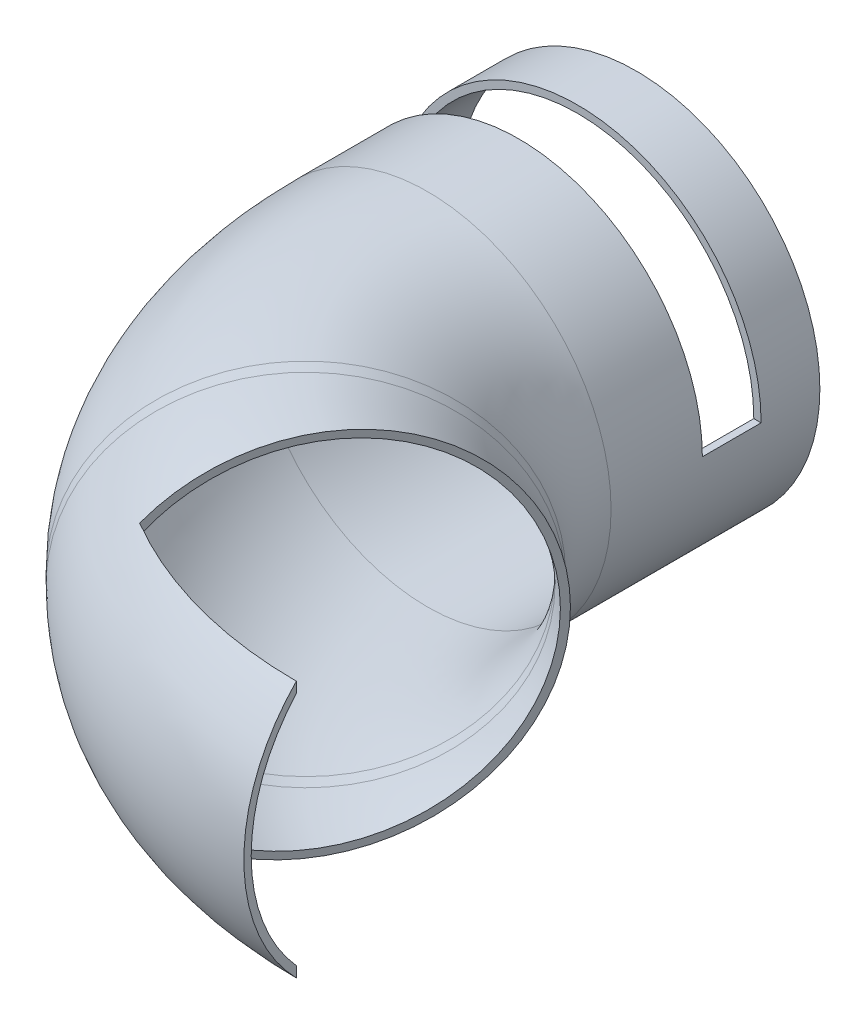
ISO-10303-21;
HEADER;
FILE_DESCRIPTION(('STEP AP214'),'2;1');
FILE_NAME('part.step','',(''),(''),'','','');
FILE_SCHEMA(('AUTOMOTIVE_DESIGN { 1 0 10303 214 1 1 1 1 }'));
ENDSEC;
DATA;
#1=APPLICATION_CONTEXT('core data for automotive mechanical design processes');
#2=APPLICATION_PROTOCOL_DEFINITION('international standard','automotive_design',2000,#1);
#3=PRODUCT_CONTEXT('',#1,'mechanical');
#4=PRODUCT('Part','Part','',(#3));
#5=PRODUCT_RELATED_PRODUCT_CATEGORY('part','',(#4));
#6=PRODUCT_DEFINITION_FORMATION('','',#4);
#7=PRODUCT_DEFINITION_CONTEXT('part definition',#1,'design');
#8=PRODUCT_DEFINITION('design','',#6,#7);
#9=PRODUCT_DEFINITION_SHAPE('','',#8);
#10=(LENGTH_UNIT() NAMED_UNIT(*) SI_UNIT(.MILLI.,.METRE.));
#11=(NAMED_UNIT(*) PLANE_ANGLE_UNIT() SI_UNIT($,.RADIAN.));
#12=(NAMED_UNIT(*) SI_UNIT($,.STERADIAN.) SOLID_ANGLE_UNIT());
#13=UNCERTAINTY_MEASURE_WITH_UNIT(LENGTH_MEASURE(1.E-05),#10,'distance_accuracy_value','');
#14=(GEOMETRIC_REPRESENTATION_CONTEXT(3) GLOBAL_UNCERTAINTY_ASSIGNED_CONTEXT((#13)) GLOBAL_UNIT_ASSIGNED_CONTEXT((#10,
#11,#12)) REPRESENTATION_CONTEXT('',''));
#15=CARTESIAN_POINT('',(0.,0.,0.));
#16=DIRECTION('',(0.,0.,1.));
#17=DIRECTION('',(1.,0.,0.));
#18=AXIS2_PLACEMENT_3D('',#15,#16,#17);
#19=CARTESIAN_POINT('',(0.,0.,0.));
#20=DIRECTION('',(0.,0.,1.));
#21=DIRECTION('',(1.,0.,0.));
#22=AXIS2_PLACEMENT_3D('',#19,#20,#21);
#23=CYLINDRICAL_SURFACE('',#22,25.);
#24=CARTESIAN_POINT('',(0.,0.,28.4314575050761));
#25=DIRECTION('',(0.,0.,1.));
#26=DIRECTION('',(1.,0.,0.));
#27=AXIS2_PLACEMENT_3D('',#24,#25,#26);
#28=CIRCLE('',#27,25.);
#29=CARTESIAN_POINT('',(-25.,0.,28.4314575050761));
#30=VERTEX_POINT('',#29);
#31=EDGE_CURVE('E157',#30,#30,#28,.T.);
#32=ORIENTED_EDGE('',*,*,#31,.F.);
#33=EDGE_LOOP('',(#32));
#34=FACE_BOUND('',#33,.T.);
#35=CARTESIAN_POINT('',(0.,0.,0.));
#36=DIRECTION('',(0.,0.,1.));
#37=DIRECTION('',(1.,0.,0.));
#38=AXIS2_PLACEMENT_3D('',#35,#36,#37);
#39=CIRCLE('',#38,25.);
#40=CARTESIAN_POINT('',(25.,0.,0.));
#41=VERTEX_POINT('',#40);
#42=EDGE_CURVE('E177',#41,#41,#39,.T.);
#43=ORIENTED_EDGE('',*,*,#42,.T.);
#44=EDGE_LOOP('',(#43));
#45=FACE_BOUND('',#44,.T.);
#46=DIRECTION('',(0.,0.,-1.));
#47=VECTOR('',#46,1.);
#48=CARTESIAN_POINT('',(25.,0.,16.));
#49=LINE('',#48,#47);
#50=CARTESIAN_POINT('',(25.,0.,16.));
#51=VERTEX_POINT('',#50);
#52=CARTESIAN_POINT('',(25.,0.,8.00000000000001));
#53=VERTEX_POINT('',#52);
#54=EDGE_CURVE('E118',#51,#53,#49,.T.);
#55=ORIENTED_EDGE('',*,*,#54,.F.);
#56=CARTESIAN_POINT('',(0.,0.,16.));
#57=DIRECTION('',(0.,0.,-1.));
#58=DIRECTION('',(-1.,0.,0.));
#59=AXIS2_PLACEMENT_3D('',#56,#57,#58);
#60=CIRCLE('',#59,25.);
#61=CARTESIAN_POINT('',(-25.,0.,16.));
#62=VERTEX_POINT('',#61);
#63=EDGE_CURVE('E114',#51,#62,#60,.F.);
#64=ORIENTED_EDGE('',*,*,#63,.T.);
#65=DIRECTION('',(0.,0.,1.));
#66=VECTOR('',#65,1.);
#67=CARTESIAN_POINT('',(-25.,0.,16.));
#68=LINE('',#67,#66);
#69=CARTESIAN_POINT('',(-25.,0.,8.00000000000001));
#70=VERTEX_POINT('',#69);
#71=EDGE_CURVE('E122',#70,#62,#68,.T.);
#72=ORIENTED_EDGE('',*,*,#71,.F.);
#73=CARTESIAN_POINT('',(0.,0.,8.00000000000001));
#74=DIRECTION('',(0.,0.,1.));
#75=DIRECTION('',(1.,0.,0.));
#76=AXIS2_PLACEMENT_3D('',#73,#74,#75);
#77=CIRCLE('',#76,25.);
#78=EDGE_CURVE('E129',#70,#53,#77,.F.);
#79=ORIENTED_EDGE('',*,*,#78,.T.);
#80=EDGE_LOOP('',(#55,#64,#72,#79));
#81=FACE_BOUND('',#80,.T.);
#82=ADVANCED_FACE('F44',(#34,#45,#81),#23,.T.);
#83=CARTESIAN_POINT('',(40.,0.,28.4314575050761));
#84=DIRECTION('',(0.,1.,0.));
#85=DIRECTION('',(0.,0.,1.));
#86=AXIS2_PLACEMENT_3D('',#83,#84,#85);
#87=TOROIDAL_SURFACE('',#86,40.,25.);
#88=CARTESIAN_POINT('',(11.7157287525381,0.,56.715728752538));
#89=DIRECTION('',(0.707106781186546,0.,0.707106781186549));
#90=DIRECTION('',(0.707106781186549,0.,-0.707106781186546));
#91=AXIS2_PLACEMENT_3D('',#88,#89,#90);
#92=CIRCLE('',#91,25.);
#93=CARTESIAN_POINT('',(-5.96194077712566,0.,74.3933982822016));
#94=VERTEX_POINT('',#93);
#95=EDGE_CURVE('E182',#94,#94,#92,.T.);
#96=CARTESIAN_POINT('',(40.,0.,28.4314575050761));
#97=DIRECTION('',(0.,1.,0.));
#98=DIRECTION('',(0.,0.,1.));
#99=AXIS2_PLACEMENT_3D('',#96,#97,#98);
#100=CIRCLE('',#99,65.);
#101=EDGE_CURVE('',#30,#94,#100,.T.);
#102=ORIENTED_EDGE('',*,*,#31,.T.);
#103=ORIENTED_EDGE('',*,*,#95,.F.);
#104=ORIENTED_EDGE('',*,*,#101,.T.);
#105=ORIENTED_EDGE('',*,*,#101,.F.);
#106=EDGE_LOOP('',(#102,#104,#103,#105));
#107=FACE_BOUND('',#106,.T.);
#108=ADVANCED_FACE('F213',(#107),#87,.T.);
#109=CARTESIAN_POINT('',(11.7157287525381,0.,56.715728752538));
#110=DIRECTION('',(0.707106781186543,0.,0.707106781186552));
#111=DIRECTION('',(0.707106781186552,0.,-0.707106781186543));
#112=AXIS2_PLACEMENT_3D('',#109,#110,#111);
#113=CYLINDRICAL_SURFACE('',#112,25.);
#114=CARTESIAN_POINT('',(13.033008588991,0.,58.0330085889909));
#115=DIRECTION('',(0.707106781186543,0.,0.707106781186552));
#116=DIRECTION('',(0.707106781186552,0.,-0.707106781186543));
#117=AXIS2_PLACEMENT_3D('',#114,#115,#116);
#118=CIRCLE('',#117,25.);
#119=CARTESIAN_POINT('',(30.7106781186548,0.,40.3553390593273));
#120=VERTEX_POINT('',#119);
#121=EDGE_CURVE('E179',#120,#120,#118,.T.);
#122=ORIENTED_EDGE('',*,*,#121,.F.);
#123=EDGE_LOOP('',(#122));
#124=FACE_BOUND('',#123,.T.);
#125=ORIENTED_EDGE('',*,*,#95,.T.);
#126=EDGE_LOOP('',(#125));
#127=FACE_BOUND('',#126,.T.);
#128=ADVANCED_FACE('F226',(#124,#127),#113,.T.);
#129=CARTESIAN_POINT('',(41.3172798364529,0.,29.748737341529));
#130=DIRECTION('',(0.,1.,0.));
#131=DIRECTION('',(0.,0.,1.));
#132=AXIS2_PLACEMENT_3D('',#129,#130,#131);
#133=TOROIDAL_SURFACE('',#132,39.9999999999999,25.);
#134=CARTESIAN_POINT('',(41.3172798364529,17.5,29.748737341529));
#135=DIRECTION('',(0.,1.,0.));
#136=DIRECTION('',(-0.506589296021684,0.,0.862187500000003));
#137=AXIS2_PLACEMENT_3D('',#134,#135,#136);
#138=CIRCLE('',#137,57.8535710713573);
#139=CARTESIAN_POINT('',(12.0092799950735,17.5,79.6293631496151));
#140=VERTEX_POINT('',#139);
#141=CARTESIAN_POINT('',(41.3172798364533,17.5,87.6023084128864));
#142=VERTEX_POINT('',#141);
#143=EDGE_CURVE('E138',#140,#142,#138,.T.);
#144=ORIENTED_EDGE('',*,*,#143,.F.);
#145=CARTESIAN_POINT('',(21.0537079955856,0.,64.2362373415291));
#146=DIRECTION('',(0.862187500000001,0.,0.506589296021686));
#147=DIRECTION('',(0.506589296021686,0.,-0.862187500000001));
#148=AXIS2_PLACEMENT_3D('',#145,#146,#147);
#149=CIRCLE('',#148,25.0000000000002);
#150=CARTESIAN_POINT('',(12.0092799950735,-17.5,79.6293631496151));
#151=VERTEX_POINT('',#150);
#152=EDGE_CURVE('E128',#151,#140,#149,.T.);
#153=ORIENTED_EDGE('',*,*,#152,.F.);
#154=CARTESIAN_POINT('',(41.3172798364529,-17.5,29.748737341529));
#155=DIRECTION('',(0.,1.,0.));
#156=DIRECTION('',(-0.506589296021684,0.,0.862187500000003));
#157=AXIS2_PLACEMENT_3D('',#154,#155,#156);
#158=CIRCLE('',#157,57.8535710713573);
#159=CARTESIAN_POINT('',(41.3172798364533,-17.5,87.6023084128864));
#160=VERTEX_POINT('',#159);
#161=EDGE_CURVE('E141',#151,#160,#158,.T.);
#162=ORIENTED_EDGE('',*,*,#161,.T.);
#163=CARTESIAN_POINT('',(41.3172798364529,0.,69.748737341529));
#164=DIRECTION('',(1.,0.,0.));
#165=DIRECTION('',(0.,0.,-1.));
#166=AXIS2_PLACEMENT_3D('',#163,#164,#165);
#167=CIRCLE('',#166,25.);
#168=EDGE_CURVE('E162',#142,#160,#167,.T.);
#169=ORIENTED_EDGE('',*,*,#168,.F.);
#170=EDGE_LOOP('',(#144,#153,#162,#169));
#171=FACE_BOUND('',#170,.T.);
#172=ORIENTED_EDGE('',*,*,#121,.T.);
#173=EDGE_LOOP('',(#172));
#174=FACE_BOUND('',#173,.T.);
#175=ADVANCED_FACE('F46',(#171,#174),#133,.T.);
#176=CARTESIAN_POINT('',(0.,0.,0.));
#177=DIRECTION('',(0.,0.,1.));
#178=DIRECTION('',(1.,0.,0.));
#179=AXIS2_PLACEMENT_3D('',#176,#177,#178);
#180=PLANE('',#179);
#181=CARTESIAN_POINT('',(0.,0.,0.));
#182=DIRECTION('',(0.,0.,1.));
#183=DIRECTION('',(1.,0.,0.));
#184=AXIS2_PLACEMENT_3D('',#181,#182,#183);
#185=CIRCLE('',#184,24.);
#186=CARTESIAN_POINT('',(24.,0.,0.));
#187=VERTEX_POINT('',#186);
#188=EDGE_CURVE('E158',#187,#187,#185,.F.);
#189=ORIENTED_EDGE('',*,*,#188,.F.);
#190=EDGE_LOOP('',(#189));
#191=FACE_BOUND('',#190,.T.);
#192=ORIENTED_EDGE('',*,*,#42,.F.);
#193=EDGE_LOOP('',(#192));
#194=FACE_BOUND('',#193,.T.);
#195=ADVANCED_FACE('F247',(#191,#194),#180,.F.);
#196=CARTESIAN_POINT('',(41.3172798364529,0.,69.748737341529));
#197=DIRECTION('',(1.,0.,0.));
#198=DIRECTION('',(0.,0.,-1.));
#199=AXIS2_PLACEMENT_3D('',#196,#197,#198);
#200=PLANE('',#199);
#201=DIRECTION('',(0.,-1.,-1.80479577913684E-13));
#202=VECTOR('',#201,1.);
#203=CARTESIAN_POINT('',(41.3172798364533,17.5,87.6023084128863));
#204=LINE('',#203,#202);
#205=CARTESIAN_POINT('',(41.3172798364533,16.0390149323455,87.6023084128861));
#206=VERTEX_POINT('',#205);
#207=EDGE_CURVE('E140',#142,#206,#204,.T.);
#208=ORIENTED_EDGE('',*,*,#207,.F.);
#209=ORIENTED_EDGE('',*,*,#168,.T.);
#210=DIRECTION('',(0.,-1.,0.));
#211=VECTOR('',#210,1.);
#212=CARTESIAN_POINT('',(41.3172798364533,-16.0390149323453,87.6023084128862));
#213=LINE('',#212,#211);
#214=CARTESIAN_POINT('',(41.3172798364533,-16.0390149323453,87.6023084128862));
#215=VERTEX_POINT('',#214);
#216=EDGE_CURVE('E154',#215,#160,#213,.T.);
#217=ORIENTED_EDGE('',*,*,#216,.F.);
#218=CARTESIAN_POINT('',(41.3172798364529,0.,69.748737341529));
#219=DIRECTION('',(1.,0.,0.));
#220=DIRECTION('',(0.,0.,-1.));
#221=AXIS2_PLACEMENT_3D('',#218,#219,#220);
#222=CIRCLE('',#221,24.);
#223=EDGE_CURVE('E171',#215,#206,#222,.F.);
#224=ORIENTED_EDGE('',*,*,#223,.T.);
#225=EDGE_LOOP('',(#208,#209,#217,#224));
#226=FACE_BOUND('',#225,.T.);
#227=ADVANCED_FACE('F245',(#226),#200,.T.);
#228=CARTESIAN_POINT('',(0.,0.,0.));
#229=DIRECTION('',(0.,0.,1.));
#230=DIRECTION('',(1.,0.,0.));
#231=AXIS2_PLACEMENT_3D('',#228,#229,#230);
#232=CYLINDRICAL_SURFACE('',#231,24.);
#233=DIRECTION('',(0.,0.,1.));
#234=VECTOR('',#233,1.);
#235=CARTESIAN_POINT('',(24.,0.,0.));
#236=LINE('',#235,#234);
#237=CARTESIAN_POINT('',(24.,0.,8.00000000000001));
#238=VERTEX_POINT('',#237);
#239=CARTESIAN_POINT('',(24.,0.,16.));
#240=VERTEX_POINT('',#239);
#241=EDGE_CURVE('E13',#238,#240,#236,.T.);
#242=ORIENTED_EDGE('',*,*,#241,.F.);
#243=CARTESIAN_POINT('',(0.,0.,8.00000000000001));
#244=DIRECTION('',(0.,0.,1.));
#245=DIRECTION('',(1.,0.,0.));
#246=AXIS2_PLACEMENT_3D('',#243,#244,#245);
#247=CIRCLE('',#246,24.);
#248=CARTESIAN_POINT('',(-24.,0.,8.00000000000001));
#249=VERTEX_POINT('',#248);
#250=EDGE_CURVE('E188',#238,#249,#247,.T.);
#251=ORIENTED_EDGE('',*,*,#250,.T.);
#252=DIRECTION('',(0.,0.,1.));
#253=VECTOR('',#252,1.);
#254=CARTESIAN_POINT('',(-24.,0.,0.));
#255=LINE('',#254,#253);
#256=CARTESIAN_POINT('',(-24.,0.,16.));
#257=VERTEX_POINT('',#256);
#258=EDGE_CURVE('E174',#257,#249,#255,.F.);
#259=ORIENTED_EDGE('',*,*,#258,.F.);
#260=CARTESIAN_POINT('',(0.,0.,16.));
#261=DIRECTION('',(0.,0.,-1.));
#262=DIRECTION('',(-1.,0.,0.));
#263=AXIS2_PLACEMENT_3D('',#260,#261,#262);
#264=CIRCLE('',#263,24.);
#265=EDGE_CURVE('E52',#257,#240,#264,.T.);
#266=ORIENTED_EDGE('',*,*,#265,.T.);
#267=EDGE_LOOP('',(#242,#251,#259,#266));
#268=FACE_BOUND('',#267,.T.);
#269=CARTESIAN_POINT('',(0.,0.,28.4314575050761));
#270=DIRECTION('',(0.,0.,1.));
#271=DIRECTION('',(1.,0.,0.));
#272=AXIS2_PLACEMENT_3D('',#269,#270,#271);
#273=CIRCLE('',#272,24.);
#274=CARTESIAN_POINT('',(-24.,0.,28.4314575050761));
#275=VERTEX_POINT('',#274);
#276=EDGE_CURVE('E161',#275,#275,#273,.F.);
#277=ORIENTED_EDGE('',*,*,#276,.F.);
#278=EDGE_LOOP('',(#277));
#279=FACE_BOUND('',#278,.T.);
#280=ORIENTED_EDGE('',*,*,#188,.T.);
#281=EDGE_LOOP('',(#280));
#282=FACE_BOUND('',#281,.T.);
#283=ADVANCED_FACE('F192',(#268,#279,#282),#232,.F.);
#284=CARTESIAN_POINT('',(40.,0.,28.4314575050761));
#285=DIRECTION('',(0.,1.,0.));
#286=DIRECTION('',(0.,0.,1.));
#287=AXIS2_PLACEMENT_3D('',#284,#285,#286);
#288=TOROIDAL_SURFACE('',#287,40.,24.);
#289=CARTESIAN_POINT('',(11.7157287525381,0.,56.715728752538));
#290=DIRECTION('',(0.707106781186546,0.,0.707106781186549));
#291=DIRECTION('',(0.707106781186549,0.,-0.707106781186546));
#292=AXIS2_PLACEMENT_3D('',#289,#290,#291);
#293=CIRCLE('',#292,24.);
#294=CARTESIAN_POINT('',(-5.25483399593912,0.,73.6862915010151));
#295=VERTEX_POINT('',#294);
#296=EDGE_CURVE('E165',#295,#295,#293,.F.);
#297=CARTESIAN_POINT('',(40.,0.,28.4314575050761));
#298=DIRECTION('',(0.,1.,0.));
#299=DIRECTION('',(0.,0.,1.));
#300=AXIS2_PLACEMENT_3D('',#297,#298,#299);
#301=CIRCLE('',#300,64.);
#302=EDGE_CURVE('',#275,#295,#301,.T.);
#303=ORIENTED_EDGE('',*,*,#276,.T.);
#304=ORIENTED_EDGE('',*,*,#296,.F.);
#305=ORIENTED_EDGE('',*,*,#302,.T.);
#306=ORIENTED_EDGE('',*,*,#302,.F.);
#307=EDGE_LOOP('',(#303,#305,#304,#306));
#308=FACE_BOUND('',#307,.T.);
#309=ADVANCED_FACE('F239',(#308),#288,.F.);
#310=CARTESIAN_POINT('',(11.7157287525381,0.,56.715728752538));
#311=DIRECTION('',(0.707106781186543,0.,0.707106781186552));
#312=DIRECTION('',(0.707106781186552,0.,-0.707106781186543));
#313=AXIS2_PLACEMENT_3D('',#310,#311,#312);
#314=CYLINDRICAL_SURFACE('',#313,24.);
#315=CARTESIAN_POINT('',(13.033008588991,0.,58.0330085889909));
#316=DIRECTION('',(0.707106781186543,0.,0.707106781186552));
#317=DIRECTION('',(0.707106781186552,0.,-0.707106781186543));
#318=AXIS2_PLACEMENT_3D('',#315,#316,#317);
#319=CIRCLE('',#318,24.);
#320=CARTESIAN_POINT('',(30.0035713374682,0.,41.0624458405138));
#321=VERTEX_POINT('',#320);
#322=EDGE_CURVE('E168',#321,#321,#319,.F.);
#323=ORIENTED_EDGE('',*,*,#322,.F.);
#324=EDGE_LOOP('',(#323));
#325=FACE_BOUND('',#324,.T.);
#326=ORIENTED_EDGE('',*,*,#296,.T.);
#327=EDGE_LOOP('',(#326));
#328=FACE_BOUND('',#327,.T.);
#329=ADVANCED_FACE('F233',(#325,#328),#314,.F.);
#330=CARTESIAN_POINT('',(41.3172798364529,0.,29.748737341529));
#331=DIRECTION('',(0.,1.,0.));
#332=DIRECTION('',(0.,0.,1.));
#333=AXIS2_PLACEMENT_3D('',#330,#331,#332);
#334=TOROIDAL_SURFACE('',#333,39.9999999999999,24.);
#335=CARTESIAN_POINT('',(41.3172798364529,16.0390149323455,29.748737341529));
#336=DIRECTION('',(0.,1.,0.));
#337=DIRECTION('',(-0.506589296021684,0.,0.862187500000003));
#338=AXIS2_PLACEMENT_3D('',#335,#336,#337);
#339=CIRCLE('',#338,57.853571071357);
#340=CARTESIAN_POINT('',(12.0092799950737,16.0390149323455,79.6293631496148));
#341=VERTEX_POINT('',#340);
#342=EDGE_CURVE('E148',#341,#206,#339,.T.);
#343=ORIENTED_EDGE('',*,*,#342,.T.);
#344=ORIENTED_EDGE('',*,*,#223,.F.);
#345=CARTESIAN_POINT('',(41.3172798364529,-16.0390149323453,29.748737341529));
#346=DIRECTION('',(0.,1.,0.));
#347=DIRECTION('',(-0.506589296021684,0.,0.862187500000003));
#348=AXIS2_PLACEMENT_3D('',#345,#346,#347);
#349=CIRCLE('',#348,57.8535710713572);
#350=CARTESIAN_POINT('',(12.0092799950736,-16.0390149323452,79.629363149615));
#351=VERTEX_POINT('',#350);
#352=EDGE_CURVE('E151',#351,#215,#349,.T.);
#353=ORIENTED_EDGE('',*,*,#352,.F.);
#354=CARTESIAN_POINT('',(21.0537079955856,0.,64.2362373415291));
#355=DIRECTION('',(-0.862187500000001,0.,-0.506589296021686));
#356=DIRECTION('',(0.506589296021686,0.,-0.862187500000001));
#357=AXIS2_PLACEMENT_3D('',#354,#355,#356);
#358=CIRCLE('',#357,24.);
#359=EDGE_CURVE('E146',#341,#351,#358,.T.);
#360=ORIENTED_EDGE('',*,*,#359,.F.);
#361=EDGE_LOOP('',(#343,#344,#353,#360));
#362=FACE_BOUND('',#361,.T.);
#363=ORIENTED_EDGE('',*,*,#322,.T.);
#364=EDGE_LOOP('',(#363));
#365=FACE_BOUND('',#364,.T.);
#366=ADVANCED_FACE('F217',(#362,#365),#334,.F.);
#367=CARTESIAN_POINT('',(21.0537079955856,0.,64.2362373415291));
#368=DIRECTION('',(0.862187500000001,0.,0.506589296021686));
#369=DIRECTION('',(0.506589296021686,0.,-0.862187500000001));
#370=AXIS2_PLACEMENT_3D('',#367,#368,#369);
#371=PLANE('',#370);
#372=ORIENTED_EDGE('',*,*,#152,.T.);
#373=DIRECTION('',(0.,-1.,-1.55607236082454E-13));
#374=VECTOR('',#373,1.);
#375=CARTESIAN_POINT('',(12.0092799950735,17.5,79.6293631496151));
#376=LINE('',#375,#374);
#377=EDGE_CURVE('E132',#140,#341,#376,.T.);
#378=ORIENTED_EDGE('',*,*,#377,.T.);
#379=ORIENTED_EDGE('',*,*,#359,.T.);
#380=DIRECTION('',(0.,-1.,0.));
#381=VECTOR('',#380,1.);
#382=CARTESIAN_POINT('',(12.0092799950736,-16.0390149323453,79.629363149615));
#383=LINE('',#382,#381);
#384=EDGE_CURVE('E144',#351,#151,#383,.T.);
#385=ORIENTED_EDGE('',*,*,#384,.T.);
#386=EDGE_LOOP('',(#372,#378,#379,#385));
#387=FACE_BOUND('',#386,.T.);
#388=ADVANCED_FACE('F204',(#387),#371,.T.);
#389=CARTESIAN_POINT('',(41.3172798364529,0.,29.748737341529));
#390=DIRECTION('',(0.,1.,0.));
#391=DIRECTION('',(0.,0.,1.));
#392=AXIS2_PLACEMENT_3D('',#389,#390,#391);
#393=CYLINDRICAL_SURFACE('',#392,57.8535710713572);
#394=ORIENTED_EDGE('',*,*,#342,.F.);
#395=ORIENTED_EDGE('',*,*,#377,.F.);
#396=ORIENTED_EDGE('',*,*,#143,.T.);
#397=ORIENTED_EDGE('',*,*,#207,.T.);
#398=EDGE_LOOP('',(#394,#395,#396,#397));
#399=FACE_BOUND('',#398,.T.);
#400=ADVANCED_FACE('F210',(#399),#393,.F.);
#401=CARTESIAN_POINT('',(41.3172798364529,0.,29.748737341529));
#402=DIRECTION('',(0.,1.,0.));
#403=DIRECTION('',(0.,0.,1.));
#404=AXIS2_PLACEMENT_3D('',#401,#402,#403);
#405=CYLINDRICAL_SURFACE('',#404,57.8535710713572);
#406=ORIENTED_EDGE('',*,*,#216,.T.);
#407=ORIENTED_EDGE('',*,*,#161,.F.);
#408=ORIENTED_EDGE('',*,*,#384,.F.);
#409=ORIENTED_EDGE('',*,*,#352,.T.);
#410=EDGE_LOOP('',(#406,#407,#408,#409));
#411=FACE_BOUND('',#410,.T.);
#412=ADVANCED_FACE('F202',(#411),#405,.F.);
#413=CARTESIAN_POINT('',(0.,0.,0.));
#414=DIRECTION('',(0.,-1.,0.));
#415=DIRECTION('',(0.,0.,-1.));
#416=AXIS2_PLACEMENT_3D('',#413,#414,#415);
#417=PLANE('',#416);
#418=ORIENTED_EDGE('',*,*,#241,.T.);
#419=DIRECTION('',(1.,0.,0.));
#420=VECTOR('',#419,1.);
#421=CARTESIAN_POINT('',(-25.,0.,16.));
#422=LINE('',#421,#420);
#423=EDGE_CURVE('E119',#240,#51,#422,.T.);
#424=ORIENTED_EDGE('',*,*,#423,.T.);
#425=ORIENTED_EDGE('',*,*,#54,.T.);
#426=DIRECTION('',(-1.,0.,0.));
#427=VECTOR('',#426,1.);
#428=CARTESIAN_POINT('',(-25.,0.,8.00000000000001));
#429=LINE('',#428,#427);
#430=EDGE_CURVE('E134',#53,#238,#429,.T.);
#431=ORIENTED_EDGE('',*,*,#430,.T.);
#432=EDGE_LOOP('',(#418,#424,#425,#431));
#433=FACE_BOUND('',#432,.T.);
#434=ADVANCED_FACE('F200',(#433),#417,.F.);
#435=CARTESIAN_POINT('',(-25.,65.,16.));
#436=DIRECTION('',(0.,0.,-1.));
#437=DIRECTION('',(-1.,0.,0.));
#438=AXIS2_PLACEMENT_3D('',#435,#436,#437);
#439=PLANE('',#438);
#440=ORIENTED_EDGE('',*,*,#423,.F.);
#441=ORIENTED_EDGE('',*,*,#265,.F.);
#442=EDGE_CURVE('E64',#62,#257,#422,.T.);
#443=ORIENTED_EDGE('',*,*,#442,.F.);
#444=ORIENTED_EDGE('',*,*,#63,.F.);
#445=EDGE_LOOP('',(#440,#441,#443,#444));
#446=FACE_BOUND('',#445,.T.);
#447=ADVANCED_FACE('F112',(#446),#439,.T.);
#448=CARTESIAN_POINT('',(-25.,65.,8.00000000000001));
#449=DIRECTION('',(0.,0.,1.));
#450=DIRECTION('',(1.,0.,0.));
#451=AXIS2_PLACEMENT_3D('',#448,#449,#450);
#452=PLANE('',#451);
#453=EDGE_CURVE('E59',#249,#70,#429,.T.);
#454=ORIENTED_EDGE('',*,*,#453,.F.);
#455=ORIENTED_EDGE('',*,*,#250,.F.);
#456=ORIENTED_EDGE('',*,*,#430,.F.);
#457=ORIENTED_EDGE('',*,*,#78,.F.);
#458=EDGE_LOOP('',(#454,#455,#456,#457));
#459=FACE_BOUND('',#458,.T.);
#460=ADVANCED_FACE('F195',(#459),#452,.T.);
#461=ORIENTED_EDGE('',*,*,#258,.T.);
#462=ORIENTED_EDGE('',*,*,#453,.T.);
#463=ORIENTED_EDGE('',*,*,#71,.T.);
#464=ORIENTED_EDGE('',*,*,#442,.T.);
#465=EDGE_LOOP('',(#461,#462,#463,#464));
#466=FACE_BOUND('',#465,.T.);
#467=ADVANCED_FACE('F123',(#466),#417,.F.);
#468=CLOSED_SHELL('',(#82,#108,#128,#175,#195,#227,#283,#309,#329,#366,#388,#400,#412,#434,#447,
#460,#467));
#469=MANIFOLD_SOLID_BREP('B2',#468);
#470=ADVANCED_BREP_SHAPE_REPRESENTATION('',(#18,#469),#14);
#471=SHAPE_DEFINITION_REPRESENTATION(#9,#470);
ENDSEC;
END-ISO-10303-21;
